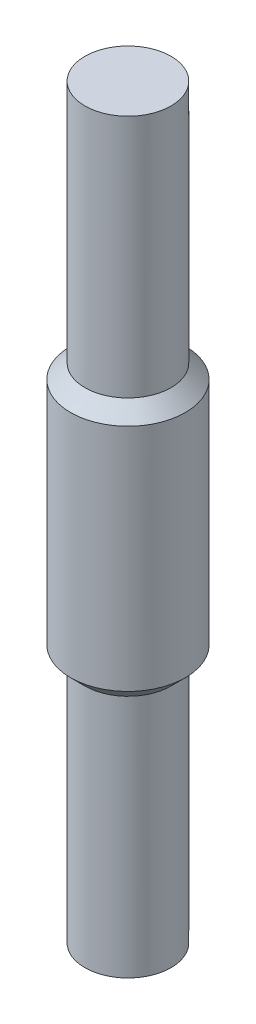
ISO-10303-21;
HEADER;
FILE_DESCRIPTION(('STEP AP214'),'2;1');
FILE_NAME('part.step','',(''),(''),'','','');
FILE_SCHEMA(('AUTOMOTIVE_DESIGN { 1 0 10303 214 1 1 1 1 }'));
ENDSEC;
DATA;
#1=APPLICATION_CONTEXT('core data for automotive mechanical design processes');
#2=APPLICATION_PROTOCOL_DEFINITION('international standard','automotive_design',2000,#1);
#3=PRODUCT_CONTEXT('',#1,'mechanical');
#4=PRODUCT('Part','Part','',(#3));
#5=PRODUCT_RELATED_PRODUCT_CATEGORY('part','',(#4));
#6=PRODUCT_DEFINITION_FORMATION('','',#4);
#7=PRODUCT_DEFINITION_CONTEXT('part definition',#1,'design');
#8=PRODUCT_DEFINITION('design','',#6,#7);
#9=PRODUCT_DEFINITION_SHAPE('','',#8);
#10=(LENGTH_UNIT() NAMED_UNIT(*) SI_UNIT(.MILLI.,.METRE.));
#11=(NAMED_UNIT(*) PLANE_ANGLE_UNIT() SI_UNIT($,.RADIAN.));
#12=(NAMED_UNIT(*) SI_UNIT($,.STERADIAN.) SOLID_ANGLE_UNIT());
#13=UNCERTAINTY_MEASURE_WITH_UNIT(LENGTH_MEASURE(1.E-05),#10,'distance_accuracy_value','');
#14=(GEOMETRIC_REPRESENTATION_CONTEXT(3) GLOBAL_UNCERTAINTY_ASSIGNED_CONTEXT((#13)) GLOBAL_UNIT_ASSIGNED_CONTEXT((#10,
#11,#12)) REPRESENTATION_CONTEXT('',''));
#15=CARTESIAN_POINT('',(0.,0.,0.));
#16=DIRECTION('',(0.,0.,1.));
#17=DIRECTION('',(1.,0.,0.));
#18=AXIS2_PLACEMENT_3D('',#15,#16,#17);
#19=CARTESIAN_POINT('',(0.,10.,0.));
#20=DIRECTION('',(0.,-1.,0.));
#21=DIRECTION('',(0.,0.,-1.));
#22=AXIS2_PLACEMENT_3D('',#19,#20,#21);
#23=CYLINDRICAL_SURFACE('',#22,2.);
#24=CARTESIAN_POINT('',(0.,1.00000000000002,0.));
#25=DIRECTION('',(0.,1.,0.));
#26=DIRECTION('',(0.,0.,1.));
#27=AXIS2_PLACEMENT_3D('',#24,#25,#26);
#28=CIRCLE('',#27,2.);
#29=CARTESIAN_POINT('',(0.,1.00000000000002,2.));
#30=VERTEX_POINT('',#29);
#31=EDGE_CURVE('E54',#30,#30,#28,.T.);
#32=ORIENTED_EDGE('',*,*,#31,.T.);
#33=EDGE_LOOP('',(#32));
#34=FACE_BOUND('',#33,.T.);
#35=CARTESIAN_POINT('',(0.,8.99999999999999,0.));
#36=DIRECTION('',(0.,1.,0.));
#37=DIRECTION('',(0.,0.,1.));
#38=AXIS2_PLACEMENT_3D('',#35,#36,#37);
#39=CIRCLE('',#38,2.);
#40=CARTESIAN_POINT('',(0.,8.99999999999999,2.));
#41=VERTEX_POINT('',#40);
#42=EDGE_CURVE('E58',#41,#41,#39,.F.);
#43=ORIENTED_EDGE('',*,*,#42,.T.);
#44=EDGE_LOOP('',(#43));
#45=FACE_BOUND('',#44,.T.);
#46=ADVANCED_FACE('F42',(#34,#45),#23,.T.);
#47=CARTESIAN_POINT('',(0.,-8.,0.));
#48=DIRECTION('',(0.,1.,0.));
#49=DIRECTION('',(0.,0.,1.));
#50=AXIS2_PLACEMENT_3D('',#47,#48,#49);
#51=CYLINDRICAL_SURFACE('',#50,1.5);
#52=CARTESIAN_POINT('',(0.,0.500000000000013,0.));
#53=DIRECTION('',(0.,1.,0.));
#54=DIRECTION('',(0.,0.,1.));
#55=AXIS2_PLACEMENT_3D('',#52,#53,#54);
#56=CIRCLE('',#55,1.5);
#57=CARTESIAN_POINT('',(0.,0.500000000000013,1.5));
#58=VERTEX_POINT('',#57);
#59=EDGE_CURVE('E50',#58,#58,#56,.F.);
#60=ORIENTED_EDGE('',*,*,#59,.T.);
#61=EDGE_LOOP('',(#60));
#62=FACE_BOUND('',#61,.T.);
#63=CARTESIAN_POINT('',(0.,-8.,0.));
#64=DIRECTION('',(0.,-1.,0.));
#65=DIRECTION('',(0.,0.,-1.));
#66=AXIS2_PLACEMENT_3D('',#63,#64,#65);
#67=CIRCLE('',#66,1.5);
#68=CARTESIAN_POINT('',(0.,-8.,-1.5));
#69=VERTEX_POINT('',#68);
#70=EDGE_CURVE('E63',#69,#69,#67,.T.);
#71=ORIENTED_EDGE('',*,*,#70,.F.);
#72=EDGE_LOOP('',(#71));
#73=FACE_BOUND('',#72,.T.);
#74=ADVANCED_FACE('F82',(#62,#73),#51,.T.);
#75=CARTESIAN_POINT('',(0.,-8.,0.));
#76=DIRECTION('',(0.,-1.,0.));
#77=DIRECTION('',(0.,0.,-1.));
#78=AXIS2_PLACEMENT_3D('',#75,#76,#77);
#79=PLANE('',#78);
#80=ORIENTED_EDGE('',*,*,#70,.T.);
#81=EDGE_LOOP('',(#80));
#82=FACE_BOUND('',#81,.T.);
#83=ADVANCED_FACE('F74',(#82),#79,.T.);
#84=CARTESIAN_POINT('',(0.,18.,0.));
#85=DIRECTION('',(0.,-1.,0.));
#86=DIRECTION('',(0.,0.,-1.));
#87=AXIS2_PLACEMENT_3D('',#84,#85,#86);
#88=CYLINDRICAL_SURFACE('',#87,1.5);
#89=CARTESIAN_POINT('',(0.,9.49999999999999,0.));
#90=DIRECTION('',(0.,-1.,0.));
#91=DIRECTION('',(0.,0.,-1.));
#92=AXIS2_PLACEMENT_3D('',#89,#90,#91);
#93=CIRCLE('',#92,1.5);
#94=CARTESIAN_POINT('',(0.,9.49999999999999,-1.5));
#95=VERTEX_POINT('',#94);
#96=EDGE_CURVE('E10',#95,#95,#93,.F.);
#97=ORIENTED_EDGE('',*,*,#96,.T.);
#98=EDGE_LOOP('',(#97));
#99=FACE_BOUND('',#98,.T.);
#100=CARTESIAN_POINT('',(0.,18.,0.));
#101=DIRECTION('',(0.,1.,0.));
#102=DIRECTION('',(0.,0.,1.));
#103=AXIS2_PLACEMENT_3D('',#100,#101,#102);
#104=CIRCLE('',#103,1.5);
#105=CARTESIAN_POINT('',(0.,18.,1.5));
#106=VERTEX_POINT('',#105);
#107=EDGE_CURVE('E66',#106,#106,#104,.T.);
#108=ORIENTED_EDGE('',*,*,#107,.F.);
#109=EDGE_LOOP('',(#108));
#110=FACE_BOUND('',#109,.T.);
#111=ADVANCED_FACE('F72',(#99,#110),#88,.T.);
#112=CARTESIAN_POINT('',(0.,18.,0.));
#113=DIRECTION('',(0.,1.,0.));
#114=DIRECTION('',(0.,0.,1.));
#115=AXIS2_PLACEMENT_3D('',#112,#113,#114);
#116=PLANE('',#115);
#117=ORIENTED_EDGE('',*,*,#107,.T.);
#118=EDGE_LOOP('',(#117));
#119=FACE_BOUND('',#118,.T.);
#120=ADVANCED_FACE('F70',(#119),#116,.T.);
#121=CARTESIAN_POINT('',(0.,1.00000000000002,0.));
#122=DIRECTION('',(0.,1.,0.));
#123=DIRECTION('',(0.,0.,1.));
#124=AXIS2_PLACEMENT_3D('',#121,#122,#123);
#125=CONICAL_SURFACE('',#124,2.,0.785398163397443);
#126=ORIENTED_EDGE('',*,*,#59,.F.);
#127=EDGE_LOOP('',(#126));
#128=FACE_BOUND('',#127,.T.);
#129=ORIENTED_EDGE('',*,*,#31,.F.);
#130=EDGE_LOOP('',(#129));
#131=FACE_BOUND('',#130,.T.);
#132=ADVANCED_FACE('F80',(#128,#131),#125,.T.);
#133=CARTESIAN_POINT('',(0.,10.,0.));
#134=DIRECTION('',(0.,-1.,0.));
#135=DIRECTION('',(0.,0.,-1.));
#136=AXIS2_PLACEMENT_3D('',#133,#134,#135);
#137=CONICAL_SURFACE('',#136,0.999999999999982,0.785398163397453);
#138=ORIENTED_EDGE('',*,*,#42,.F.);
#139=EDGE_LOOP('',(#138));
#140=FACE_BOUND('',#139,.T.);
#141=ORIENTED_EDGE('',*,*,#96,.F.);
#142=EDGE_LOOP('',(#141));
#143=FACE_BOUND('',#142,.T.);
#144=ADVANCED_FACE('F45',(#140,#143),#137,.T.);
#145=CLOSED_SHELL('',(#46,#74,#83,#111,#120,#132,#144));
#146=MANIFOLD_SOLID_BREP('B2',#145);
#147=ADVANCED_BREP_SHAPE_REPRESENTATION('',(#18,#146),#14);
#148=SHAPE_DEFINITION_REPRESENTATION(#9,#147);
ENDSEC;
END-ISO-10303-21;
